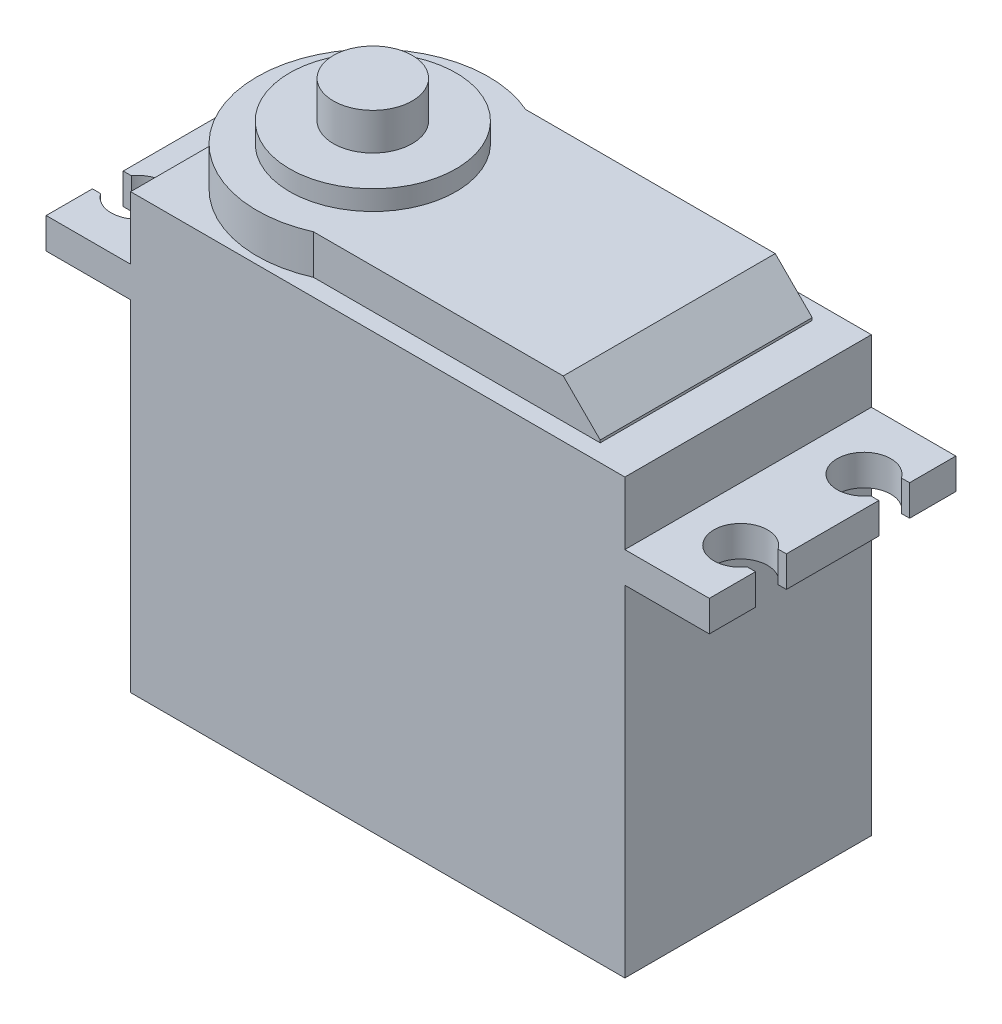
ISO-10303-21;
HEADER;
FILE_DESCRIPTION(('STEP AP214'),'2;1');
FILE_NAME('part.step','',(''),(''),'','','');
FILE_SCHEMA(('AUTOMOTIVE_DESIGN { 1 0 10303 214 1 1 1 1 }'));
ENDSEC;
DATA;
#1=APPLICATION_CONTEXT('core data for automotive mechanical design processes');
#2=APPLICATION_PROTOCOL_DEFINITION('international standard','automotive_design',2000,#1);
#3=PRODUCT_CONTEXT('',#1,'mechanical');
#4=PRODUCT('Part','Part','',(#3));
#5=PRODUCT_RELATED_PRODUCT_CATEGORY('part','',(#4));
#6=PRODUCT_DEFINITION_FORMATION('','',#4);
#7=PRODUCT_DEFINITION_CONTEXT('part definition',#1,'design');
#8=PRODUCT_DEFINITION('design','',#6,#7);
#9=PRODUCT_DEFINITION_SHAPE('','',#8);
#10=(LENGTH_UNIT() NAMED_UNIT(*) SI_UNIT(.MILLI.,.METRE.));
#11=(NAMED_UNIT(*) PLANE_ANGLE_UNIT() SI_UNIT($,.RADIAN.));
#12=(NAMED_UNIT(*) SI_UNIT($,.STERADIAN.) SOLID_ANGLE_UNIT());
#13=UNCERTAINTY_MEASURE_WITH_UNIT(LENGTH_MEASURE(1.E-05),#10,'distance_accuracy_value','');
#14=(GEOMETRIC_REPRESENTATION_CONTEXT(3) GLOBAL_UNCERTAINTY_ASSIGNED_CONTEXT((#13)) GLOBAL_UNIT_ASSIGNED_CONTEXT((#10,
#11,#12)) REPRESENTATION_CONTEXT('',''));
#15=CARTESIAN_POINT('',(0.,0.,0.));
#16=DIRECTION('',(0.,0.,1.));
#17=DIRECTION('',(1.,0.,0.));
#18=AXIS2_PLACEMENT_3D('',#15,#16,#17);
#19=CARTESIAN_POINT('',(0.,0.,20.));
#20=DIRECTION('',(0.,0.,1.));
#21=DIRECTION('',(1.,0.,0.));
#22=AXIS2_PLACEMENT_3D('',#19,#20,#21);
#23=PLANE('',#22);
#24=DIRECTION('',(-1.,0.,0.));
#25=VECTOR('',#24,1.);
#26=CARTESIAN_POINT('',(36.7,35.2,20.));
#27=LINE('',#26,#25);
#28=CARTESIAN_POINT('',(40.1,35.2,20.));
#29=VERTEX_POINT('',#28);
#30=CARTESIAN_POINT('',(0.,35.2,20.));
#31=VERTEX_POINT('',#30);
#32=EDGE_CURVE('E416',#29,#31,#27,.T.);
#33=ORIENTED_EDGE('',*,*,#32,.T.);
#34=DIRECTION('',(0.,-1.,0.));
#35=VECTOR('',#34,1.);
#36=CARTESIAN_POINT('',(0.,38.4,20.));
#37=LINE('',#36,#35);
#38=CARTESIAN_POINT('',(0.,30.1,20.));
#39=VERTEX_POINT('',#38);
#40=EDGE_CURVE('E393',#31,#39,#37,.T.);
#41=ORIENTED_EDGE('',*,*,#40,.T.);
#42=DIRECTION('',(-1.,0.,0.));
#43=VECTOR('',#42,1.);
#44=CARTESIAN_POINT('',(-6.85,30.1,20.));
#45=LINE('',#44,#43);
#46=CARTESIAN_POINT('',(-6.85,30.1,20.));
#47=VERTEX_POINT('',#46);
#48=EDGE_CURVE('E395',#39,#47,#45,.T.);
#49=ORIENTED_EDGE('',*,*,#48,.T.);
#50=DIRECTION('',(0.,-1.,0.));
#51=VECTOR('',#50,1.);
#52=CARTESIAN_POINT('',(-6.85,27.6,20.));
#53=LINE('',#52,#51);
#54=CARTESIAN_POINT('',(-6.85,27.6,20.));
#55=VERTEX_POINT('',#54);
#56=EDGE_CURVE('E398',#47,#55,#53,.T.);
#57=ORIENTED_EDGE('',*,*,#56,.T.);
#58=DIRECTION('',(1.,0.,0.));
#59=VECTOR('',#58,1.);
#60=CARTESIAN_POINT('',(0.,27.6,20.));
#61=LINE('',#60,#59);
#62=CARTESIAN_POINT('',(0.,27.6,20.));
#63=VERTEX_POINT('',#62);
#64=EDGE_CURVE('E400',#55,#63,#61,.T.);
#65=ORIENTED_EDGE('',*,*,#64,.T.);
#66=DIRECTION('',(0.,-1.,0.));
#67=VECTOR('',#66,1.);
#68=CARTESIAN_POINT('',(0.,27.6,20.));
#69=LINE('',#68,#67);
#70=CARTESIAN_POINT('',(0.,0.,20.));
#71=VERTEX_POINT('',#70);
#72=EDGE_CURVE('E402',#63,#71,#69,.T.);
#73=ORIENTED_EDGE('',*,*,#72,.T.);
#74=DIRECTION('',(1.,0.,0.));
#75=VECTOR('',#74,1.);
#76=CARTESIAN_POINT('',(0.,0.,20.));
#77=LINE('',#76,#75);
#78=CARTESIAN_POINT('',(40.1,0.,20.));
#79=VERTEX_POINT('',#78);
#80=EDGE_CURVE('E404',#71,#79,#77,.T.);
#81=ORIENTED_EDGE('',*,*,#80,.T.);
#82=DIRECTION('',(0.,1.,0.));
#83=VECTOR('',#82,1.);
#84=CARTESIAN_POINT('',(40.1,27.6,20.));
#85=LINE('',#84,#83);
#86=CARTESIAN_POINT('',(40.1,27.6,20.));
#87=VERTEX_POINT('',#86);
#88=EDGE_CURVE('E406',#79,#87,#85,.T.);
#89=ORIENTED_EDGE('',*,*,#88,.T.);
#90=DIRECTION('',(1.,0.,0.));
#91=VECTOR('',#90,1.);
#92=CARTESIAN_POINT('',(40.1,27.6,20.));
#93=LINE('',#92,#91);
#94=CARTESIAN_POINT('',(46.95,27.6,20.));
#95=VERTEX_POINT('',#94);
#96=EDGE_CURVE('E408',#87,#95,#93,.T.);
#97=ORIENTED_EDGE('',*,*,#96,.T.);
#98=DIRECTION('',(0.,1.,0.));
#99=VECTOR('',#98,1.);
#100=CARTESIAN_POINT('',(46.95,27.6,20.));
#101=LINE('',#100,#99);
#102=CARTESIAN_POINT('',(46.95,30.1,20.));
#103=VERTEX_POINT('',#102);
#104=EDGE_CURVE('E410',#95,#103,#101,.T.);
#105=ORIENTED_EDGE('',*,*,#104,.T.);
#106=DIRECTION('',(-1.,0.,0.));
#107=VECTOR('',#106,1.);
#108=CARTESIAN_POINT('',(46.95,30.1,20.));
#109=LINE('',#108,#107);
#110=CARTESIAN_POINT('',(40.1,30.1,20.));
#111=VERTEX_POINT('',#110);
#112=EDGE_CURVE('E412',#103,#111,#109,.T.);
#113=ORIENTED_EDGE('',*,*,#112,.T.);
#114=DIRECTION('',(0.,1.,0.));
#115=VECTOR('',#114,1.);
#116=CARTESIAN_POINT('',(40.1,35.2,20.));
#117=LINE('',#116,#115);
#118=EDGE_CURVE('E414',#111,#29,#117,.T.);
#119=ORIENTED_EDGE('',*,*,#118,.T.);
#120=EDGE_LOOP('',(#33,#41,#49,#57,#65,#73,#81,#89,#97,#105,#113,#119));
#121=FACE_BOUND('',#120,.T.);
#122=ADVANCED_FACE('F40',(#121),#23,.T.);
#123=CARTESIAN_POINT('',(0.,0.,0.));
#124=DIRECTION('',(0.,0.,1.));
#125=DIRECTION('',(1.,0.,0.));
#126=AXIS2_PLACEMENT_3D('',#123,#124,#125);
#127=PLANE('',#126);
#128=DIRECTION('',(0.,-1.,0.));
#129=VECTOR('',#128,1.);
#130=CARTESIAN_POINT('',(0.,38.4,0.));
#131=LINE('',#130,#129);
#132=CARTESIAN_POINT('',(0.,35.2,0.));
#133=VERTEX_POINT('',#132);
#134=CARTESIAN_POINT('',(0.,30.1,0.));
#135=VERTEX_POINT('',#134);
#136=EDGE_CURVE('E385',#133,#135,#131,.T.);
#137=ORIENTED_EDGE('',*,*,#136,.F.);
#138=DIRECTION('',(-1.,0.,0.));
#139=VECTOR('',#138,1.);
#140=CARTESIAN_POINT('',(36.7,35.2,0.));
#141=LINE('',#140,#139);
#142=CARTESIAN_POINT('',(40.1,35.2,0.));
#143=VERTEX_POINT('',#142);
#144=EDGE_CURVE('E396',#143,#133,#141,.T.);
#145=ORIENTED_EDGE('',*,*,#144,.F.);
#146=DIRECTION('',(0.,1.,0.));
#147=VECTOR('',#146,1.);
#148=CARTESIAN_POINT('',(40.1,35.2,0.));
#149=LINE('',#148,#147);
#150=CARTESIAN_POINT('',(40.1,30.1,0.));
#151=VERTEX_POINT('',#150);
#152=EDGE_CURVE('E442',#151,#143,#149,.T.);
#153=ORIENTED_EDGE('',*,*,#152,.F.);
#154=DIRECTION('',(-1.,0.,0.));
#155=VECTOR('',#154,1.);
#156=CARTESIAN_POINT('',(46.95,30.1,0.));
#157=LINE('',#156,#155);
#158=CARTESIAN_POINT('',(46.95,30.1,0.));
#159=VERTEX_POINT('',#158);
#160=EDGE_CURVE('E440',#159,#151,#157,.T.);
#161=ORIENTED_EDGE('',*,*,#160,.F.);
#162=DIRECTION('',(0.,1.,0.));
#163=VECTOR('',#162,1.);
#164=CARTESIAN_POINT('',(46.95,27.6,0.));
#165=LINE('',#164,#163);
#166=CARTESIAN_POINT('',(46.95,27.6,0.));
#167=VERTEX_POINT('',#166);
#168=EDGE_CURVE('E437',#167,#159,#165,.T.);
#169=ORIENTED_EDGE('',*,*,#168,.F.);
#170=DIRECTION('',(1.,0.,0.));
#171=VECTOR('',#170,1.);
#172=CARTESIAN_POINT('',(40.1,27.6,0.));
#173=LINE('',#172,#171);
#174=CARTESIAN_POINT('',(40.1,27.6,0.));
#175=VERTEX_POINT('',#174);
#176=EDGE_CURVE('E434',#175,#167,#173,.T.);
#177=ORIENTED_EDGE('',*,*,#176,.F.);
#178=DIRECTION('',(0.,1.,0.));
#179=VECTOR('',#178,1.);
#180=CARTESIAN_POINT('',(40.1,27.6,0.));
#181=LINE('',#180,#179);
#182=CARTESIAN_POINT('',(40.1,0.,0.));
#183=VERTEX_POINT('',#182);
#184=EDGE_CURVE('E432',#183,#175,#181,.T.);
#185=ORIENTED_EDGE('',*,*,#184,.F.);
#186=DIRECTION('',(1.,0.,0.));
#187=VECTOR('',#186,1.);
#188=CARTESIAN_POINT('',(0.,0.,0.));
#189=LINE('',#188,#187);
#190=CARTESIAN_POINT('',(0.,0.,0.));
#191=VERTEX_POINT('',#190);
#192=EDGE_CURVE('E430',#191,#183,#189,.T.);
#193=ORIENTED_EDGE('',*,*,#192,.F.);
#194=DIRECTION('',(0.,-1.,0.));
#195=VECTOR('',#194,1.);
#196=CARTESIAN_POINT('',(0.,27.6,0.));
#197=LINE('',#196,#195);
#198=CARTESIAN_POINT('',(0.,27.6,0.));
#199=VERTEX_POINT('',#198);
#200=EDGE_CURVE('E428',#199,#191,#197,.T.);
#201=ORIENTED_EDGE('',*,*,#200,.F.);
#202=DIRECTION('',(1.,0.,0.));
#203=VECTOR('',#202,1.);
#204=CARTESIAN_POINT('',(0.,27.6,0.));
#205=LINE('',#204,#203);
#206=CARTESIAN_POINT('',(-6.85,27.6,0.));
#207=VERTEX_POINT('',#206);
#208=EDGE_CURVE('E426',#207,#199,#205,.T.);
#209=ORIENTED_EDGE('',*,*,#208,.F.);
#210=DIRECTION('',(0.,-1.,0.));
#211=VECTOR('',#210,1.);
#212=CARTESIAN_POINT('',(-6.85,27.6,0.));
#213=LINE('',#212,#211);
#214=CARTESIAN_POINT('',(-6.85,30.1,0.));
#215=VERTEX_POINT('',#214);
#216=EDGE_CURVE('E423',#215,#207,#213,.T.);
#217=ORIENTED_EDGE('',*,*,#216,.F.);
#218=DIRECTION('',(-1.,0.,0.));
#219=VECTOR('',#218,1.);
#220=CARTESIAN_POINT('',(-6.85,30.1,0.));
#221=LINE('',#220,#219);
#222=EDGE_CURVE('E420',#135,#215,#221,.T.);
#223=ORIENTED_EDGE('',*,*,#222,.F.);
#224=EDGE_LOOP('',(#137,#145,#153,#161,#169,#177,#185,#193,#201,#209,#217,#223));
#225=FACE_BOUND('',#224,.T.);
#226=ADVANCED_FACE('F526',(#225),#127,.F.);
#227=CARTESIAN_POINT('',(0.,38.4,20.));
#228=DIRECTION('',(1.,0.,0.));
#229=DIRECTION('',(0.,1.,0.));
#230=AXIS2_PLACEMENT_3D('',#227,#228,#229);
#231=PLANE('',#230);
#232=DIRECTION('',(0.,0.,1.));
#233=VECTOR('',#232,1.);
#234=CARTESIAN_POINT('',(0.,35.2,20.));
#235=LINE('',#234,#233);
#236=EDGE_CURVE('E287',#133,#31,#235,.T.);
#237=ORIENTED_EDGE('',*,*,#236,.F.);
#238=ORIENTED_EDGE('',*,*,#136,.T.);
#239=DIRECTION('',(0.,0.,-1.));
#240=VECTOR('',#239,1.);
#241=CARTESIAN_POINT('',(0.,30.1,20.));
#242=LINE('',#241,#240);
#243=EDGE_CURVE('E483',#39,#135,#242,.T.);
#244=ORIENTED_EDGE('',*,*,#243,.F.);
#245=ORIENTED_EDGE('',*,*,#40,.F.);
#246=EDGE_LOOP('',(#237,#238,#244,#245));
#247=FACE_BOUND('',#246,.T.);
#248=ADVANCED_FACE('F517',(#247),#231,.F.);
#249=CARTESIAN_POINT('',(36.7,38.4,20.));
#250=DIRECTION('',(-1.,0.,0.));
#251=DIRECTION('',(0.,0.,1.));
#252=AXIS2_PLACEMENT_3D('',#249,#250,#251);
#253=PLANE('',#252);
#254=DIRECTION('',(0.,1.,0.));
#255=VECTOR('',#254,1.);
#256=CARTESIAN_POINT('',(36.7,35.2,1.4));
#257=LINE('',#256,#255);
#258=CARTESIAN_POINT('',(36.7,35.2,1.4));
#259=VERTEX_POINT('',#258);
#260=CARTESIAN_POINT('',(36.7,35.4,1.4));
#261=VERTEX_POINT('',#260);
#262=EDGE_CURVE('E276',#259,#261,#257,.T.);
#263=ORIENTED_EDGE('',*,*,#262,.T.);
#264=DIRECTION('',(0.,0.,1.));
#265=VECTOR('',#264,1.);
#266=CARTESIAN_POINT('',(36.7,35.4,20.));
#267=LINE('',#266,#265);
#268=CARTESIAN_POINT('',(36.7,35.4,18.6));
#269=VERTEX_POINT('',#268);
#270=EDGE_CURVE('E48',#261,#269,#267,.T.);
#271=ORIENTED_EDGE('',*,*,#270,.T.);
#272=DIRECTION('',(0.,1.,0.));
#273=VECTOR('',#272,1.);
#274=CARTESIAN_POINT('',(36.7,35.2,18.6));
#275=LINE('',#274,#273);
#276=CARTESIAN_POINT('',(36.7,35.2,18.6));
#277=VERTEX_POINT('',#276);
#278=EDGE_CURVE('E288',#277,#269,#275,.T.);
#279=ORIENTED_EDGE('',*,*,#278,.F.);
#280=DIRECTION('',(0.,0.,-1.));
#281=VECTOR('',#280,1.);
#282=CARTESIAN_POINT('',(36.7,35.2,20.));
#283=LINE('',#282,#281);
#284=EDGE_CURVE('E418',#277,#259,#283,.T.);
#285=ORIENTED_EDGE('',*,*,#284,.T.);
#286=EDGE_LOOP('',(#263,#271,#279,#285));
#287=FACE_BOUND('',#286,.T.);
#288=ADVANCED_FACE('F515',(#287),#253,.F.);
#289=CARTESIAN_POINT('',(16.402,38.4,20.));
#290=DIRECTION('',(0.,-1.,0.));
#291=DIRECTION('',(0.,0.,-1.));
#292=AXIS2_PLACEMENT_3D('',#289,#290,#291);
#293=PLANE('',#292);
#294=CARTESIAN_POINT('',(9.652,38.4,10.));
#295=DIRECTION('',(0.,1.,0.));
#296=DIRECTION('',(0.,0.,1.));
#297=AXIS2_PLACEMENT_3D('',#294,#295,#296);
#298=CIRCLE('',#297,6.75);
#299=CARTESIAN_POINT('',(9.652,38.4,16.75));
#300=VERTEX_POINT('',#299);
#301=EDGE_CURVE('E294',#300,#300,#298,.T.);
#302=ORIENTED_EDGE('',*,*,#301,.F.);
#303=EDGE_LOOP('',(#302));
#304=FACE_BOUND('',#303,.T.);
#305=DIRECTION('',(1.,0.,0.));
#306=VECTOR('',#305,1.);
#307=CARTESIAN_POINT('',(13.4467331922021,38.4,18.6));
#308=LINE('',#307,#306);
#309=CARTESIAN_POINT('',(13.4467331922021,38.4,18.6));
#310=VERTEX_POINT('',#309);
#311=CARTESIAN_POINT('',(33.7,38.4,18.6));
#312=VERTEX_POINT('',#311);
#313=EDGE_CURVE('E277',#310,#312,#308,.T.);
#314=ORIENTED_EDGE('',*,*,#313,.T.);
#315=DIRECTION('',(0.,0.,-1.));
#316=VECTOR('',#315,1.);
#317=CARTESIAN_POINT('',(33.7,38.4,20.));
#318=LINE('',#317,#316);
#319=CARTESIAN_POINT('',(33.7,38.4,1.4));
#320=VERTEX_POINT('',#319);
#321=EDGE_CURVE('E505',#312,#320,#318,.T.);
#322=ORIENTED_EDGE('',*,*,#321,.T.);
#323=DIRECTION('',(-1.,0.,0.));
#324=VECTOR('',#323,1.);
#325=CARTESIAN_POINT('',(36.7,38.4,1.4));
#326=LINE('',#325,#324);
#327=CARTESIAN_POINT('',(13.4467331922021,38.4,1.4));
#328=VERTEX_POINT('',#327);
#329=EDGE_CURVE('E283',#320,#328,#326,.T.);
#330=ORIENTED_EDGE('',*,*,#329,.T.);
#331=CARTESIAN_POINT('',(9.652,38.4,10.));
#332=DIRECTION('',(0.,1.,0.));
#333=DIRECTION('',(0.,0.,1.));
#334=AXIS2_PLACEMENT_3D('',#331,#332,#333);
#335=CIRCLE('',#334,9.4);
#336=EDGE_CURVE('E261',#328,#310,#335,.T.);
#337=ORIENTED_EDGE('',*,*,#336,.T.);
#338=EDGE_LOOP('',(#314,#322,#330,#337));
#339=FACE_BOUND('',#338,.T.);
#340=ADVANCED_FACE('F510',(#304,#339),#293,.F.);
#341=CARTESIAN_POINT('',(-6.85,27.6,20.));
#342=DIRECTION('',(1.,0.,0.));
#343=DIRECTION('',(0.,0.,-1.));
#344=AXIS2_PLACEMENT_3D('',#341,#342,#343);
#345=PLANE('',#344);
#346=DIRECTION('',(0.,0.,-1.));
#347=VECTOR('',#346,1.);
#348=CARTESIAN_POINT('',(-6.85,30.1,20.));
#349=LINE('',#348,#347);
#350=CARTESIAN_POINT('',(-6.85,30.1,16.25));
#351=VERTEX_POINT('',#350);
#352=EDGE_CURVE('E480',#47,#351,#349,.T.);
#353=ORIENTED_EDGE('',*,*,#352,.T.);
#354=DIRECTION('',(0.,1.,0.));
#355=VECTOR('',#354,1.);
#356=CARTESIAN_POINT('',(-6.84999999999999,0.,16.25));
#357=LINE('',#356,#355);
#358=CARTESIAN_POINT('',(-6.85,27.6,16.25));
#359=VERTEX_POINT('',#358);
#360=EDGE_CURVE('E351',#359,#351,#357,.T.);
#361=ORIENTED_EDGE('',*,*,#360,.F.);
#362=DIRECTION('',(0.,0.,-1.));
#363=VECTOR('',#362,1.);
#364=CARTESIAN_POINT('',(-6.85,27.6,20.));
#365=LINE('',#364,#363);
#366=EDGE_CURVE('E475',#55,#359,#365,.T.);
#367=ORIENTED_EDGE('',*,*,#366,.F.);
#368=ORIENTED_EDGE('',*,*,#56,.F.);
#369=EDGE_LOOP('',(#353,#361,#367,#368));
#370=FACE_BOUND('',#369,.T.);
#371=ADVANCED_FACE('F523',(#370),#345,.F.);
#372=CARTESIAN_POINT('',(46.95,27.6,20.));
#373=DIRECTION('',(-1.,0.,0.));
#374=DIRECTION('',(0.,0.,1.));
#375=AXIS2_PLACEMENT_3D('',#372,#373,#374);
#376=PLANE('',#375);
#377=DIRECTION('',(0.,0.,-1.));
#378=VECTOR('',#377,1.);
#379=CARTESIAN_POINT('',(46.95,27.6,20.));
#380=LINE('',#379,#378);
#381=CARTESIAN_POINT('',(46.95,27.6,13.75));
#382=VERTEX_POINT('',#381);
#383=CARTESIAN_POINT('',(46.95,27.6,6.24999999999999));
#384=VERTEX_POINT('',#383);
#385=EDGE_CURVE('E462',#382,#384,#380,.T.);
#386=ORIENTED_EDGE('',*,*,#385,.T.);
#387=DIRECTION('',(0.,1.,0.));
#388=VECTOR('',#387,1.);
#389=CARTESIAN_POINT('',(46.95,0.,6.24999999999999));
#390=LINE('',#389,#388);
#391=CARTESIAN_POINT('',(46.95,30.1,6.24999999999999));
#392=VERTEX_POINT('',#391);
#393=EDGE_CURVE('E316',#384,#392,#390,.T.);
#394=ORIENTED_EDGE('',*,*,#393,.T.);
#395=DIRECTION('',(0.,0.,-1.));
#396=VECTOR('',#395,1.);
#397=CARTESIAN_POINT('',(46.95,30.1,20.));
#398=LINE('',#397,#396);
#399=CARTESIAN_POINT('',(46.95,30.1,13.75));
#400=VERTEX_POINT('',#399);
#401=EDGE_CURVE('E457',#400,#392,#398,.T.);
#402=ORIENTED_EDGE('',*,*,#401,.F.);
#403=DIRECTION('',(0.,1.,0.));
#404=VECTOR('',#403,1.);
#405=CARTESIAN_POINT('',(46.95,0.,13.75));
#406=LINE('',#405,#404);
#407=EDGE_CURVE('E335',#382,#400,#406,.T.);
#408=ORIENTED_EDGE('',*,*,#407,.F.);
#409=EDGE_LOOP('',(#386,#394,#402,#408));
#410=FACE_BOUND('',#409,.T.);
#411=ADVANCED_FACE('F672',(#410),#376,.F.);
#412=CARTESIAN_POINT('',(46.95,30.1,3.74999999999999));
#413=VERTEX_POINT('',#412);
#414=EDGE_CURVE('E452',#413,#159,#398,.T.);
#415=ORIENTED_EDGE('',*,*,#414,.F.);
#416=DIRECTION('',(0.,1.,0.));
#417=VECTOR('',#416,1.);
#418=CARTESIAN_POINT('',(46.95,0.,3.74999999999999));
#419=LINE('',#418,#417);
#420=CARTESIAN_POINT('',(46.95,27.6,3.74999999999999));
#421=VERTEX_POINT('',#420);
#422=EDGE_CURVE('E315',#421,#413,#419,.T.);
#423=ORIENTED_EDGE('',*,*,#422,.F.);
#424=EDGE_CURVE('E456',#421,#167,#380,.T.);
#425=ORIENTED_EDGE('',*,*,#424,.T.);
#426=ORIENTED_EDGE('',*,*,#168,.T.);
#427=EDGE_LOOP('',(#415,#423,#425,#426));
#428=FACE_BOUND('',#427,.T.);
#429=ADVANCED_FACE('F674',(#428),#376,.F.);
#430=CARTESIAN_POINT('',(-6.85,27.6,3.75));
#431=VERTEX_POINT('',#430);
#432=EDGE_CURVE('E474',#431,#207,#365,.T.);
#433=ORIENTED_EDGE('',*,*,#432,.F.);
#434=DIRECTION('',(0.,1.,0.));
#435=VECTOR('',#434,1.);
#436=CARTESIAN_POINT('',(-6.84999999999999,0.,3.75));
#437=LINE('',#436,#435);
#438=CARTESIAN_POINT('',(-6.85,30.1,3.75));
#439=VERTEX_POINT('',#438);
#440=EDGE_CURVE('E382',#431,#439,#437,.T.);
#441=ORIENTED_EDGE('',*,*,#440,.T.);
#442=EDGE_CURVE('E478',#439,#215,#349,.T.);
#443=ORIENTED_EDGE('',*,*,#442,.T.);
#444=ORIENTED_EDGE('',*,*,#216,.T.);
#445=EDGE_LOOP('',(#433,#441,#443,#444));
#446=FACE_BOUND('',#445,.T.);
#447=ADVANCED_FACE('F636',(#446),#345,.F.);
#448=CARTESIAN_POINT('',(-6.85,30.1,20.));
#449=DIRECTION('',(0.,-1.,0.));
#450=DIRECTION('',(0.,0.,-1.));
#451=AXIS2_PLACEMENT_3D('',#448,#449,#450);
#452=PLANE('',#451);
#453=CARTESIAN_POINT('',(-4.4,30.1,15.));
#454=DIRECTION('',(0.,1.,0.));
#455=DIRECTION('',(1.,0.,0.));
#456=AXIS2_PLACEMENT_3D('',#453,#454,#455);
#457=CIRCLE('',#456,2.18);
#458=CARTESIAN_POINT('',(-6.18602911510423,30.1,16.25));
#459=VERTEX_POINT('',#458);
#460=CARTESIAN_POINT('',(-6.18602911510423,30.1,13.75));
#461=VERTEX_POINT('',#460);
#462=EDGE_CURVE('E303',#459,#461,#457,.T.);
#463=ORIENTED_EDGE('',*,*,#462,.F.);
#464=DIRECTION('',(1.,0.,0.));
#465=VECTOR('',#464,1.);
#466=CARTESIAN_POINT('',(-6.85,30.1,16.25));
#467=LINE('',#466,#465);
#468=EDGE_CURVE('E346',#351,#459,#467,.T.);
#469=ORIENTED_EDGE('',*,*,#468,.F.);
#470=ORIENTED_EDGE('',*,*,#352,.F.);
#471=ORIENTED_EDGE('',*,*,#48,.F.);
#472=ORIENTED_EDGE('',*,*,#243,.T.);
#473=ORIENTED_EDGE('',*,*,#222,.T.);
#474=ORIENTED_EDGE('',*,*,#442,.F.);
#475=DIRECTION('',(-1.,0.,0.));
#476=VECTOR('',#475,1.);
#477=CARTESIAN_POINT('',(-6.85,30.1,3.75));
#478=LINE('',#477,#476);
#479=CARTESIAN_POINT('',(-6.18602911510423,30.1,3.75));
#480=VERTEX_POINT('',#479);
#481=EDGE_CURVE('E374',#480,#439,#478,.T.);
#482=ORIENTED_EDGE('',*,*,#481,.F.);
#483=CARTESIAN_POINT('',(-4.4,30.1,5.));
#484=DIRECTION('',(0.,1.,0.));
#485=DIRECTION('',(-1.,0.,0.));
#486=AXIS2_PLACEMENT_3D('',#483,#484,#485);
#487=CIRCLE('',#486,2.18);
#488=CARTESIAN_POINT('',(-6.18602911510423,30.1,6.25));
#489=VERTEX_POINT('',#488);
#490=EDGE_CURVE('E379',#489,#480,#487,.T.);
#491=ORIENTED_EDGE('',*,*,#490,.F.);
#492=DIRECTION('',(1.,0.,0.));
#493=VECTOR('',#492,1.);
#494=CARTESIAN_POINT('',(-6.85,30.1,6.25));
#495=LINE('',#494,#493);
#496=CARTESIAN_POINT('',(-6.85,30.1,6.25));
#497=VERTEX_POINT('',#496);
#498=EDGE_CURVE('E376',#497,#489,#495,.T.);
#499=ORIENTED_EDGE('',*,*,#498,.F.);
#500=CARTESIAN_POINT('',(-6.85,30.1,13.75));
#501=VERTEX_POINT('',#500);
#502=EDGE_CURVE('E484',#501,#497,#349,.T.);
#503=ORIENTED_EDGE('',*,*,#502,.F.);
#504=DIRECTION('',(-1.,0.,0.));
#505=VECTOR('',#504,1.);
#506=CARTESIAN_POINT('',(-6.85,30.1,13.75));
#507=LINE('',#506,#505);
#508=EDGE_CURVE('E344',#461,#501,#507,.T.);
#509=ORIENTED_EDGE('',*,*,#508,.F.);
#510=EDGE_LOOP('',(#463,#469,#470,#471,#472,#473,#474,#482,#491,#499,#503,#509));
#511=FACE_BOUND('',#510,.T.);
#512=ADVANCED_FACE('F623',(#511),#452,.F.);
#513=CARTESIAN_POINT('',(-6.85,27.6,13.75));
#514=VERTEX_POINT('',#513);
#515=CARTESIAN_POINT('',(-6.85,27.6,6.25));
#516=VERTEX_POINT('',#515);
#517=EDGE_CURVE('E479',#514,#516,#365,.T.);
#518=ORIENTED_EDGE('',*,*,#517,.F.);
#519=DIRECTION('',(0.,1.,0.));
#520=VECTOR('',#519,1.);
#521=CARTESIAN_POINT('',(-6.84999999999999,0.,13.75));
#522=LINE('',#521,#520);
#523=EDGE_CURVE('E353',#514,#501,#522,.T.);
#524=ORIENTED_EDGE('',*,*,#523,.T.);
#525=ORIENTED_EDGE('',*,*,#502,.T.);
#526=DIRECTION('',(0.,1.,0.));
#527=VECTOR('',#526,1.);
#528=CARTESIAN_POINT('',(-6.84999999999999,0.,6.25));
#529=LINE('',#528,#527);
#530=EDGE_CURVE('E388',#516,#497,#529,.T.);
#531=ORIENTED_EDGE('',*,*,#530,.F.);
#532=EDGE_LOOP('',(#518,#524,#525,#531));
#533=FACE_BOUND('',#532,.T.);
#534=ADVANCED_FACE('F662',(#533),#345,.F.);
#535=CARTESIAN_POINT('',(0.,27.6,20.));
#536=DIRECTION('',(0.,1.,0.));
#537=DIRECTION('',(-1.,0.,0.));
#538=AXIS2_PLACEMENT_3D('',#535,#536,#537);
#539=PLANE('',#538);
#540=ORIENTED_EDGE('',*,*,#366,.T.);
#541=DIRECTION('',(1.,0.,0.));
#542=VECTOR('',#541,1.);
#543=CARTESIAN_POINT('',(0.,27.6,16.25));
#544=LINE('',#543,#542);
#545=CARTESIAN_POINT('',(-6.18602911510423,27.6,16.25));
#546=VERTEX_POINT('',#545);
#547=EDGE_CURVE('E502',#359,#546,#544,.T.);
#548=ORIENTED_EDGE('',*,*,#547,.T.);
#549=CARTESIAN_POINT('',(-4.4,27.6,15.));
#550=DIRECTION('',(0.,1.,0.));
#551=DIRECTION('',(-1.,0.,0.));
#552=AXIS2_PLACEMENT_3D('',#549,#550,#551);
#553=CIRCLE('',#552,2.18);
#554=CARTESIAN_POINT('',(-6.18602911510423,27.6,13.75));
#555=VERTEX_POINT('',#554);
#556=EDGE_CURVE('E499',#546,#555,#553,.T.);
#557=ORIENTED_EDGE('',*,*,#556,.T.);
#558=DIRECTION('',(-1.,0.,0.));
#559=VECTOR('',#558,1.);
#560=CARTESIAN_POINT('',(0.,27.6,13.75));
#561=LINE('',#560,#559);
#562=EDGE_CURVE('E496',#555,#514,#561,.T.);
#563=ORIENTED_EDGE('',*,*,#562,.T.);
#564=ORIENTED_EDGE('',*,*,#517,.T.);
#565=DIRECTION('',(1.,0.,0.));
#566=VECTOR('',#565,1.);
#567=CARTESIAN_POINT('',(0.,27.6,6.25000000000001));
#568=LINE('',#567,#566);
#569=CARTESIAN_POINT('',(-6.18602911510422,27.6,6.25));
#570=VERTEX_POINT('',#569);
#571=EDGE_CURVE('E487',#516,#570,#568,.T.);
#572=ORIENTED_EDGE('',*,*,#571,.T.);
#573=CARTESIAN_POINT('',(-4.4,27.6,5.));
#574=DIRECTION('',(0.,1.,0.));
#575=DIRECTION('',(-1.,0.,0.));
#576=AXIS2_PLACEMENT_3D('',#573,#574,#575);
#577=CIRCLE('',#576,2.18);
#578=CARTESIAN_POINT('',(-6.18602911510423,27.6,3.75));
#579=VERTEX_POINT('',#578);
#580=EDGE_CURVE('E490',#570,#579,#577,.T.);
#581=ORIENTED_EDGE('',*,*,#580,.T.);
#582=DIRECTION('',(-1.,0.,0.));
#583=VECTOR('',#582,1.);
#584=CARTESIAN_POINT('',(0.,27.6,3.74999999999999));
#585=LINE('',#584,#583);
#586=EDGE_CURVE('E493',#579,#431,#585,.T.);
#587=ORIENTED_EDGE('',*,*,#586,.T.);
#588=ORIENTED_EDGE('',*,*,#432,.T.);
#589=ORIENTED_EDGE('',*,*,#208,.T.);
#590=DIRECTION('',(0.,0.,-1.));
#591=VECTOR('',#590,1.);
#592=CARTESIAN_POINT('',(0.,27.6,20.));
#593=LINE('',#592,#591);
#594=EDGE_CURVE('E471',#63,#199,#593,.T.);
#595=ORIENTED_EDGE('',*,*,#594,.F.);
#596=ORIENTED_EDGE('',*,*,#64,.F.);
#597=EDGE_LOOP('',(#540,#548,#557,#563,#564,#572,#581,#587,#588,#589,#595,#596));
#598=FACE_BOUND('',#597,.T.);
#599=ADVANCED_FACE('F630',(#598),#539,.F.);
#600=CARTESIAN_POINT('',(0.,27.6,20.));
#601=DIRECTION('',(1.,0.,0.));
#602=DIRECTION('',(0.,1.,0.));
#603=AXIS2_PLACEMENT_3D('',#600,#601,#602);
#604=PLANE('',#603);
#605=ORIENTED_EDGE('',*,*,#200,.T.);
#606=DIRECTION('',(0.,0.,-1.));
#607=VECTOR('',#606,1.);
#608=CARTESIAN_POINT('',(0.,0.,20.));
#609=LINE('',#608,#607);
#610=EDGE_CURVE('E468',#71,#191,#609,.T.);
#611=ORIENTED_EDGE('',*,*,#610,.F.);
#612=ORIENTED_EDGE('',*,*,#72,.F.);
#613=ORIENTED_EDGE('',*,*,#594,.T.);
#614=EDGE_LOOP('',(#605,#611,#612,#613));
#615=FACE_BOUND('',#614,.T.);
#616=ADVANCED_FACE('F644',(#615),#604,.F.);
#617=CARTESIAN_POINT('',(0.,0.,20.));
#618=DIRECTION('',(0.,1.,0.));
#619=DIRECTION('',(-1.,0.,0.));
#620=AXIS2_PLACEMENT_3D('',#617,#618,#619);
#621=PLANE('',#620);
#622=ORIENTED_EDGE('',*,*,#192,.T.);
#623=DIRECTION('',(0.,0.,-1.));
#624=VECTOR('',#623,1.);
#625=CARTESIAN_POINT('',(40.1,0.,20.));
#626=LINE('',#625,#624);
#627=EDGE_CURVE('E465',#79,#183,#626,.T.);
#628=ORIENTED_EDGE('',*,*,#627,.F.);
#629=ORIENTED_EDGE('',*,*,#80,.F.);
#630=ORIENTED_EDGE('',*,*,#610,.T.);
#631=EDGE_LOOP('',(#622,#628,#629,#630));
#632=FACE_BOUND('',#631,.T.);
#633=ADVANCED_FACE('F648',(#632),#621,.F.);
#634=CARTESIAN_POINT('',(40.1,27.6,20.));
#635=DIRECTION('',(-1.,0.,0.));
#636=DIRECTION('',(0.,-1.,0.));
#637=AXIS2_PLACEMENT_3D('',#634,#635,#636);
#638=PLANE('',#637);
#639=ORIENTED_EDGE('',*,*,#184,.T.);
#640=DIRECTION('',(0.,0.,-1.));
#641=VECTOR('',#640,1.);
#642=CARTESIAN_POINT('',(40.1,27.6,20.));
#643=LINE('',#642,#641);
#644=EDGE_CURVE('E461',#87,#175,#643,.T.);
#645=ORIENTED_EDGE('',*,*,#644,.F.);
#646=ORIENTED_EDGE('',*,*,#88,.F.);
#647=ORIENTED_EDGE('',*,*,#627,.T.);
#648=EDGE_LOOP('',(#639,#645,#646,#647));
#649=FACE_BOUND('',#648,.T.);
#650=ADVANCED_FACE('F698',(#649),#638,.F.);
#651=CARTESIAN_POINT('',(40.1,27.6,20.));
#652=DIRECTION('',(0.,1.,0.));
#653=DIRECTION('',(0.,0.,1.));
#654=AXIS2_PLACEMENT_3D('',#651,#652,#653);
#655=PLANE('',#654);
#656=CARTESIAN_POINT('',(44.5,27.6,4.99999999999999));
#657=DIRECTION('',(0.,1.,0.));
#658=DIRECTION('',(0.,0.,1.));
#659=AXIS2_PLACEMENT_3D('',#656,#657,#658);
#660=CIRCLE('',#659,2.18);
#661=CARTESIAN_POINT('',(46.2860291151042,27.6,3.74999999999999));
#662=VERTEX_POINT('',#661);
#663=CARTESIAN_POINT('',(46.2860291151042,27.6,6.24999999999999));
#664=VERTEX_POINT('',#663);
#665=EDGE_CURVE('E368',#662,#664,#660,.T.);
#666=ORIENTED_EDGE('',*,*,#665,.T.);
#667=DIRECTION('',(1.,0.,0.));
#668=VECTOR('',#667,1.);
#669=CARTESIAN_POINT('',(40.1,27.6,6.25));
#670=LINE('',#669,#668);
#671=EDGE_CURVE('E371',#664,#384,#670,.T.);
#672=ORIENTED_EDGE('',*,*,#671,.T.);
#673=ORIENTED_EDGE('',*,*,#385,.F.);
#674=DIRECTION('',(-1.,0.,0.));
#675=VECTOR('',#674,1.);
#676=CARTESIAN_POINT('',(40.1,27.6,13.75));
#677=LINE('',#676,#675);
#678=CARTESIAN_POINT('',(46.2860291151042,27.6,13.75));
#679=VERTEX_POINT('',#678);
#680=EDGE_CURVE('E359',#382,#679,#677,.T.);
#681=ORIENTED_EDGE('',*,*,#680,.T.);
#682=CARTESIAN_POINT('',(44.5,27.6,15.));
#683=DIRECTION('',(0.,1.,0.));
#684=DIRECTION('',(0.,0.,1.));
#685=AXIS2_PLACEMENT_3D('',#682,#683,#684);
#686=CIRCLE('',#685,2.18);
#687=CARTESIAN_POINT('',(46.2860291151042,27.6,16.25));
#688=VERTEX_POINT('',#687);
#689=EDGE_CURVE('E362',#679,#688,#686,.T.);
#690=ORIENTED_EDGE('',*,*,#689,.T.);
#691=DIRECTION('',(1.,0.,0.));
#692=VECTOR('',#691,1.);
#693=CARTESIAN_POINT('',(40.1,27.6,16.25));
#694=LINE('',#693,#692);
#695=CARTESIAN_POINT('',(46.95,27.6,16.25));
#696=VERTEX_POINT('',#695);
#697=EDGE_CURVE('E319',#688,#696,#694,.T.);
#698=ORIENTED_EDGE('',*,*,#697,.T.);
#699=EDGE_CURVE('E458',#95,#696,#380,.T.);
#700=ORIENTED_EDGE('',*,*,#699,.F.);
#701=ORIENTED_EDGE('',*,*,#96,.F.);
#702=ORIENTED_EDGE('',*,*,#644,.T.);
#703=ORIENTED_EDGE('',*,*,#176,.T.);
#704=ORIENTED_EDGE('',*,*,#424,.F.);
#705=DIRECTION('',(-1.,0.,0.));
#706=VECTOR('',#705,1.);
#707=CARTESIAN_POINT('',(40.1,27.6,3.74999999999999));
#708=LINE('',#707,#706);
#709=EDGE_CURVE('E365',#421,#662,#708,.T.);
#710=ORIENTED_EDGE('',*,*,#709,.T.);
#711=EDGE_LOOP('',(#666,#672,#673,#681,#690,#698,#700,#701,#702,#703,#704,#710));
#712=FACE_BOUND('',#711,.T.);
#713=ADVANCED_FACE('F690',(#712),#655,.F.);
#714=ORIENTED_EDGE('',*,*,#699,.T.);
#715=DIRECTION('',(0.,1.,0.));
#716=VECTOR('',#715,1.);
#717=CARTESIAN_POINT('',(46.95,0.,16.25));
#718=LINE('',#717,#716);
#719=CARTESIAN_POINT('',(46.95,30.1,16.25));
#720=VERTEX_POINT('',#719);
#721=EDGE_CURVE('E337',#696,#720,#718,.T.);
#722=ORIENTED_EDGE('',*,*,#721,.T.);
#723=EDGE_CURVE('E453',#103,#720,#398,.T.);
#724=ORIENTED_EDGE('',*,*,#723,.F.);
#725=ORIENTED_EDGE('',*,*,#104,.F.);
#726=EDGE_LOOP('',(#714,#722,#724,#725));
#727=FACE_BOUND('',#726,.T.);
#728=ADVANCED_FACE('F680',(#727),#376,.F.);
#729=CARTESIAN_POINT('',(46.95,30.1,20.));
#730=DIRECTION('',(0.,-1.,0.));
#731=DIRECTION('',(1.,0.,0.));
#732=AXIS2_PLACEMENT_3D('',#729,#730,#731);
#733=PLANE('',#732);
#734=ORIENTED_EDGE('',*,*,#401,.T.);
#735=DIRECTION('',(1.,0.,0.));
#736=VECTOR('',#735,1.);
#737=CARTESIAN_POINT('',(46.95,30.1,6.24999999999999));
#738=LINE('',#737,#736);
#739=CARTESIAN_POINT('',(46.2860291151042,30.1,6.24999999999999));
#740=VERTEX_POINT('',#739);
#741=EDGE_CURVE('E313',#740,#392,#738,.T.);
#742=ORIENTED_EDGE('',*,*,#741,.F.);
#743=CARTESIAN_POINT('',(44.5,30.1,4.99999999999999));
#744=DIRECTION('',(0.,1.,0.));
#745=DIRECTION('',(1.,0.,0.));
#746=AXIS2_PLACEMENT_3D('',#743,#744,#745);
#747=CIRCLE('',#746,2.18);
#748=CARTESIAN_POINT('',(46.2860291151042,30.1,3.74999999999999));
#749=VERTEX_POINT('',#748);
#750=EDGE_CURVE('E309',#749,#740,#747,.T.);
#751=ORIENTED_EDGE('',*,*,#750,.F.);
#752=DIRECTION('',(-1.,0.,0.));
#753=VECTOR('',#752,1.);
#754=CARTESIAN_POINT('',(46.95,30.1,3.74999999999999));
#755=LINE('',#754,#753);
#756=EDGE_CURVE('E306',#413,#749,#755,.T.);
#757=ORIENTED_EDGE('',*,*,#756,.F.);
#758=ORIENTED_EDGE('',*,*,#414,.T.);
#759=ORIENTED_EDGE('',*,*,#160,.T.);
#760=DIRECTION('',(0.,0.,-1.));
#761=VECTOR('',#760,1.);
#762=CARTESIAN_POINT('',(40.1,30.1,20.));
#763=LINE('',#762,#761);
#764=EDGE_CURVE('E449',#111,#151,#763,.T.);
#765=ORIENTED_EDGE('',*,*,#764,.F.);
#766=ORIENTED_EDGE('',*,*,#112,.F.);
#767=ORIENTED_EDGE('',*,*,#723,.T.);
#768=DIRECTION('',(1.,0.,0.));
#769=VECTOR('',#768,1.);
#770=CARTESIAN_POINT('',(46.95,30.1,16.25));
#771=LINE('',#770,#769);
#772=CARTESIAN_POINT('',(46.2860291151042,30.1,16.25));
#773=VERTEX_POINT('',#772);
#774=EDGE_CURVE('E327',#773,#720,#771,.T.);
#775=ORIENTED_EDGE('',*,*,#774,.F.);
#776=CARTESIAN_POINT('',(44.5,30.1,15.));
#777=DIRECTION('',(0.,1.,0.));
#778=DIRECTION('',(-1.,0.,0.));
#779=AXIS2_PLACEMENT_3D('',#776,#777,#778);
#780=CIRCLE('',#779,2.18);
#781=CARTESIAN_POINT('',(46.2860291151042,30.1,13.75));
#782=VERTEX_POINT('',#781);
#783=EDGE_CURVE('E325',#782,#773,#780,.T.);
#784=ORIENTED_EDGE('',*,*,#783,.F.);
#785=DIRECTION('',(-1.,0.,0.));
#786=VECTOR('',#785,1.);
#787=CARTESIAN_POINT('',(46.95,30.1,13.75));
#788=LINE('',#787,#786);
#789=EDGE_CURVE('E330',#400,#782,#788,.T.);
#790=ORIENTED_EDGE('',*,*,#789,.F.);
#791=EDGE_LOOP('',(#734,#742,#751,#757,#758,#759,#765,#766,#767,#775,#784,#790));
#792=FACE_BOUND('',#791,.T.);
#793=ADVANCED_FACE('F689',(#792),#733,.F.);
#794=CARTESIAN_POINT('',(40.1,35.2,20.));
#795=DIRECTION('',(-1.,0.,0.));
#796=DIRECTION('',(0.,0.,1.));
#797=AXIS2_PLACEMENT_3D('',#794,#795,#796);
#798=PLANE('',#797);
#799=ORIENTED_EDGE('',*,*,#152,.T.);
#800=DIRECTION('',(0.,0.,-1.));
#801=VECTOR('',#800,1.);
#802=CARTESIAN_POINT('',(40.1,35.2,20.));
#803=LINE('',#802,#801);
#804=EDGE_CURVE('E446',#29,#143,#803,.T.);
#805=ORIENTED_EDGE('',*,*,#804,.F.);
#806=ORIENTED_EDGE('',*,*,#118,.F.);
#807=ORIENTED_EDGE('',*,*,#764,.T.);
#808=EDGE_LOOP('',(#799,#805,#806,#807));
#809=FACE_BOUND('',#808,.T.);
#810=ADVANCED_FACE('F696',(#809),#798,.F.);
#811=CARTESIAN_POINT('',(36.7,35.2,20.));
#812=DIRECTION('',(0.,-1.,0.));
#813=DIRECTION('',(0.,0.,-1.));
#814=AXIS2_PLACEMENT_3D('',#811,#812,#813);
#815=PLANE('',#814);
#816=ORIENTED_EDGE('',*,*,#284,.F.);
#817=DIRECTION('',(1.,0.,0.));
#818=VECTOR('',#817,1.);
#819=CARTESIAN_POINT('',(13.4467331922021,35.2,18.6));
#820=LINE('',#819,#818);
#821=CARTESIAN_POINT('',(13.4467331922021,35.2,18.6));
#822=VERTEX_POINT('',#821);
#823=EDGE_CURVE('E264',#822,#277,#820,.T.);
#824=ORIENTED_EDGE('',*,*,#823,.F.);
#825=CARTESIAN_POINT('',(9.652,35.2,10.));
#826=DIRECTION('',(0.,1.,0.));
#827=DIRECTION('',(0.,0.,1.));
#828=AXIS2_PLACEMENT_3D('',#825,#826,#827);
#829=CIRCLE('',#828,9.4);
#830=CARTESIAN_POINT('',(13.4467331922021,35.2,1.4));
#831=VERTEX_POINT('',#830);
#832=EDGE_CURVE('E259',#831,#822,#829,.T.);
#833=ORIENTED_EDGE('',*,*,#832,.F.);
#834=DIRECTION('',(-1.,0.,0.));
#835=VECTOR('',#834,1.);
#836=CARTESIAN_POINT('',(36.7,35.2,1.4));
#837=LINE('',#836,#835);
#838=EDGE_CURVE('E271',#259,#831,#837,.T.);
#839=ORIENTED_EDGE('',*,*,#838,.F.);
#840=EDGE_LOOP('',(#816,#824,#833,#839));
#841=FACE_BOUND('',#840,.T.);
#842=ORIENTED_EDGE('',*,*,#144,.T.);
#843=ORIENTED_EDGE('',*,*,#236,.T.);
#844=ORIENTED_EDGE('',*,*,#32,.F.);
#845=ORIENTED_EDGE('',*,*,#804,.T.);
#846=EDGE_LOOP('',(#842,#843,#844,#845));
#847=FACE_BOUND('',#846,.T.);
#848=ADVANCED_FACE('F269',(#841,#847),#815,.F.);
#849=CARTESIAN_POINT('',(-6.84999999999999,0.,3.75));
#850=DIRECTION('',(0.,0.,-1.));
#851=DIRECTION('',(-1.,0.,0.));
#852=AXIS2_PLACEMENT_3D('',#849,#850,#851);
#853=PLANE('',#852);
#854=DIRECTION('',(0.,1.,0.));
#855=VECTOR('',#854,1.);
#856=CARTESIAN_POINT('',(-6.18602911510422,0.,3.75));
#857=LINE('',#856,#855);
#858=EDGE_CURVE('E383',#579,#480,#857,.T.);
#859=ORIENTED_EDGE('',*,*,#858,.T.);
#860=ORIENTED_EDGE('',*,*,#481,.T.);
#861=ORIENTED_EDGE('',*,*,#440,.F.);
#862=ORIENTED_EDGE('',*,*,#586,.F.);
#863=EDGE_LOOP('',(#859,#860,#861,#862));
#864=FACE_BOUND('',#863,.T.);
#865=ADVANCED_FACE('F538',(#864),#853,.F.);
#866=CARTESIAN_POINT('',(-4.39999999999999,0.,5.));
#867=DIRECTION('',(0.,1.,0.));
#868=DIRECTION('',(-1.,0.,0.));
#869=AXIS2_PLACEMENT_3D('',#866,#867,#868);
#870=CYLINDRICAL_SURFACE('',#869,2.18);
#871=DIRECTION('',(0.,1.,0.));
#872=VECTOR('',#871,1.);
#873=CARTESIAN_POINT('',(-6.18602911510422,0.,6.25));
#874=LINE('',#873,#872);
#875=EDGE_CURVE('E386',#570,#489,#874,.T.);
#876=ORIENTED_EDGE('',*,*,#875,.T.);
#877=ORIENTED_EDGE('',*,*,#490,.T.);
#878=ORIENTED_EDGE('',*,*,#858,.F.);
#879=ORIENTED_EDGE('',*,*,#580,.F.);
#880=EDGE_LOOP('',(#876,#877,#878,#879));
#881=FACE_BOUND('',#880,.T.);
#882=ADVANCED_FACE('F607',(#881),#870,.F.);
#883=CARTESIAN_POINT('',(-6.84999999999999,0.,6.25));
#884=DIRECTION('',(0.,0.,1.));
#885=DIRECTION('',(1.,0.,0.));
#886=AXIS2_PLACEMENT_3D('',#883,#884,#885);
#887=PLANE('',#886);
#888=ORIENTED_EDGE('',*,*,#530,.T.);
#889=ORIENTED_EDGE('',*,*,#498,.T.);
#890=ORIENTED_EDGE('',*,*,#875,.F.);
#891=ORIENTED_EDGE('',*,*,#571,.F.);
#892=EDGE_LOOP('',(#888,#889,#890,#891));
#893=FACE_BOUND('',#892,.T.);
#894=ADVANCED_FACE('F599',(#893),#887,.F.);
#895=CARTESIAN_POINT('',(44.5,0.,15.));
#896=DIRECTION('',(0.,1.,0.));
#897=DIRECTION('',(-1.,0.,0.));
#898=AXIS2_PLACEMENT_3D('',#895,#896,#897);
#899=CYLINDRICAL_SURFACE('',#898,2.18);
#900=DIRECTION('',(0.,1.,0.));
#901=VECTOR('',#900,1.);
#902=CARTESIAN_POINT('',(46.2860291151042,0.,13.75));
#903=LINE('',#902,#901);
#904=EDGE_CURVE('E310',#679,#782,#903,.T.);
#905=ORIENTED_EDGE('',*,*,#904,.T.);
#906=ORIENTED_EDGE('',*,*,#783,.T.);
#907=DIRECTION('',(0.,1.,0.));
#908=VECTOR('',#907,1.);
#909=CARTESIAN_POINT('',(46.2860291151042,0.,16.25));
#910=LINE('',#909,#908);
#911=EDGE_CURVE('E333',#688,#773,#910,.T.);
#912=ORIENTED_EDGE('',*,*,#911,.F.);
#913=ORIENTED_EDGE('',*,*,#689,.F.);
#914=EDGE_LOOP('',(#905,#906,#912,#913));
#915=FACE_BOUND('',#914,.T.);
#916=ADVANCED_FACE('F592',(#915),#899,.F.);
#917=CARTESIAN_POINT('',(46.95,0.,13.75));
#918=DIRECTION('',(0.,0.,-1.));
#919=DIRECTION('',(-1.,0.,0.));
#920=AXIS2_PLACEMENT_3D('',#917,#918,#919);
#921=PLANE('',#920);
#922=ORIENTED_EDGE('',*,*,#407,.T.);
#923=ORIENTED_EDGE('',*,*,#789,.T.);
#924=ORIENTED_EDGE('',*,*,#904,.F.);
#925=ORIENTED_EDGE('',*,*,#680,.F.);
#926=EDGE_LOOP('',(#922,#923,#924,#925));
#927=FACE_BOUND('',#926,.T.);
#928=ADVANCED_FACE('F589',(#927),#921,.F.);
#929=CARTESIAN_POINT('',(46.95,0.,16.25));
#930=DIRECTION('',(0.,0.,1.));
#931=DIRECTION('',(1.,0.,0.));
#932=AXIS2_PLACEMENT_3D('',#929,#930,#931);
#933=PLANE('',#932);
#934=ORIENTED_EDGE('',*,*,#911,.T.);
#935=ORIENTED_EDGE('',*,*,#774,.T.);
#936=ORIENTED_EDGE('',*,*,#721,.F.);
#937=ORIENTED_EDGE('',*,*,#697,.F.);
#938=EDGE_LOOP('',(#934,#935,#936,#937));
#939=FACE_BOUND('',#938,.T.);
#940=ADVANCED_FACE('F579',(#939),#933,.F.);
#941=CARTESIAN_POINT('',(46.95,0.,6.24999999999999));
#942=DIRECTION('',(0.,0.,1.));
#943=DIRECTION('',(1.,0.,0.));
#944=AXIS2_PLACEMENT_3D('',#941,#942,#943);
#945=PLANE('',#944);
#946=DIRECTION('',(0.,1.,0.));
#947=VECTOR('',#946,1.);
#948=CARTESIAN_POINT('',(46.2860291151042,0.,6.24999999999999));
#949=LINE('',#948,#947);
#950=EDGE_CURVE('E320',#664,#740,#949,.T.);
#951=ORIENTED_EDGE('',*,*,#950,.T.);
#952=ORIENTED_EDGE('',*,*,#741,.T.);
#953=ORIENTED_EDGE('',*,*,#393,.F.);
#954=ORIENTED_EDGE('',*,*,#671,.F.);
#955=EDGE_LOOP('',(#951,#952,#953,#954));
#956=FACE_BOUND('',#955,.T.);
#957=ADVANCED_FACE('F575',(#956),#945,.F.);
#958=CARTESIAN_POINT('',(44.5,0.,4.99999999999999));
#959=DIRECTION('',(0.,1.,0.));
#960=DIRECTION('',(-1.,0.,0.));
#961=AXIS2_PLACEMENT_3D('',#958,#959,#960);
#962=CYLINDRICAL_SURFACE('',#961,2.18);
#963=DIRECTION('',(0.,1.,0.));
#964=VECTOR('',#963,1.);
#965=CARTESIAN_POINT('',(46.2860291151042,0.,3.74999999999999));
#966=LINE('',#965,#964);
#967=EDGE_CURVE('E322',#662,#749,#966,.T.);
#968=ORIENTED_EDGE('',*,*,#967,.T.);
#969=ORIENTED_EDGE('',*,*,#750,.T.);
#970=ORIENTED_EDGE('',*,*,#950,.F.);
#971=ORIENTED_EDGE('',*,*,#665,.F.);
#972=EDGE_LOOP('',(#968,#969,#970,#971));
#973=FACE_BOUND('',#972,.T.);
#974=ADVANCED_FACE('F578',(#973),#962,.F.);
#975=CARTESIAN_POINT('',(46.95,0.,3.74999999999999));
#976=DIRECTION('',(0.,0.,-1.));
#977=DIRECTION('',(-1.,0.,0.));
#978=AXIS2_PLACEMENT_3D('',#975,#976,#977);
#979=PLANE('',#978);
#980=ORIENTED_EDGE('',*,*,#422,.T.);
#981=ORIENTED_EDGE('',*,*,#756,.T.);
#982=ORIENTED_EDGE('',*,*,#967,.F.);
#983=ORIENTED_EDGE('',*,*,#709,.F.);
#984=EDGE_LOOP('',(#980,#981,#982,#983));
#985=FACE_BOUND('',#984,.T.);
#986=ADVANCED_FACE('F583',(#985),#979,.F.);
#987=CARTESIAN_POINT('',(-4.39999999999999,0.,15.));
#988=DIRECTION('',(0.,1.,0.));
#989=DIRECTION('',(-1.,0.,0.));
#990=AXIS2_PLACEMENT_3D('',#987,#988,#989);
#991=CYLINDRICAL_SURFACE('',#990,2.18);
#992=DIRECTION('',(0.,1.,0.));
#993=VECTOR('',#992,1.);
#994=CARTESIAN_POINT('',(-6.18602911510422,0.,16.25));
#995=LINE('',#994,#993);
#996=EDGE_CURVE('E328',#546,#459,#995,.T.);
#997=ORIENTED_EDGE('',*,*,#996,.T.);
#998=ORIENTED_EDGE('',*,*,#462,.T.);
#999=DIRECTION('',(0.,1.,0.));
#1000=VECTOR('',#999,1.);
#1001=CARTESIAN_POINT('',(-6.18602911510422,0.,13.75));
#1002=LINE('',#1001,#1000);
#1003=EDGE_CURVE('E349',#555,#461,#1002,.T.);
#1004=ORIENTED_EDGE('',*,*,#1003,.F.);
#1005=ORIENTED_EDGE('',*,*,#556,.F.);
#1006=EDGE_LOOP('',(#997,#998,#1004,#1005));
#1007=FACE_BOUND('',#1006,.T.);
#1008=ADVANCED_FACE('F587',(#1007),#991,.F.);
#1009=CARTESIAN_POINT('',(-6.84999999999999,0.,16.25));
#1010=DIRECTION('',(0.,0.,1.));
#1011=DIRECTION('',(1.,0.,0.));
#1012=AXIS2_PLACEMENT_3D('',#1009,#1010,#1011);
#1013=PLANE('',#1012);
#1014=ORIENTED_EDGE('',*,*,#360,.T.);
#1015=ORIENTED_EDGE('',*,*,#468,.T.);
#1016=ORIENTED_EDGE('',*,*,#996,.F.);
#1017=ORIENTED_EDGE('',*,*,#547,.F.);
#1018=EDGE_LOOP('',(#1014,#1015,#1016,#1017));
#1019=FACE_BOUND('',#1018,.T.);
#1020=ADVANCED_FACE('F569',(#1019),#1013,.F.);
#1021=CARTESIAN_POINT('',(-6.84999999999999,0.,13.75));
#1022=DIRECTION('',(0.,0.,-1.));
#1023=DIRECTION('',(-1.,0.,0.));
#1024=AXIS2_PLACEMENT_3D('',#1021,#1022,#1023);
#1025=PLANE('',#1024);
#1026=ORIENTED_EDGE('',*,*,#1003,.T.);
#1027=ORIENTED_EDGE('',*,*,#508,.T.);
#1028=ORIENTED_EDGE('',*,*,#523,.F.);
#1029=ORIENTED_EDGE('',*,*,#562,.F.);
#1030=EDGE_LOOP('',(#1026,#1027,#1028,#1029));
#1031=FACE_BOUND('',#1030,.T.);
#1032=ADVANCED_FACE('F556',(#1031),#1025,.F.);
#1033=CARTESIAN_POINT('',(9.652,38.4,10.));
#1034=DIRECTION('',(0.,1.,0.));
#1035=DIRECTION('',(0.,0.,1.));
#1036=AXIS2_PLACEMENT_3D('',#1033,#1034,#1035);
#1037=CYLINDRICAL_SURFACE('',#1036,6.75);
#1038=CARTESIAN_POINT('',(9.652,40.,10.));
#1039=DIRECTION('',(0.,1.,0.));
#1040=DIRECTION('',(0.,0.,1.));
#1041=AXIS2_PLACEMENT_3D('',#1038,#1039,#1040);
#1042=CIRCLE('',#1041,6.75);
#1043=CARTESIAN_POINT('',(9.652,40.,16.75));
#1044=VERTEX_POINT('',#1043);
#1045=EDGE_CURVE('E293',#1044,#1044,#1042,.T.);
#1046=ORIENTED_EDGE('',*,*,#1045,.F.);
#1047=EDGE_LOOP('',(#1046));
#1048=FACE_BOUND('',#1047,.T.);
#1049=ORIENTED_EDGE('',*,*,#301,.T.);
#1050=EDGE_LOOP('',(#1049));
#1051=FACE_BOUND('',#1050,.T.);
#1052=ADVANCED_FACE('F548',(#1048,#1051),#1037,.T.);
#1053=CARTESIAN_POINT('',(6.452,43.,20.));
#1054=DIRECTION('',(0.,-1.,0.));
#1055=DIRECTION('',(0.,0.,-1.));
#1056=AXIS2_PLACEMENT_3D('',#1053,#1054,#1055);
#1057=PLANE('',#1056);
#1058=CARTESIAN_POINT('',(9.65199999999995,43.,10.));
#1059=DIRECTION('',(0.,1.,0.));
#1060=DIRECTION('',(-1.,0.,0.));
#1061=AXIS2_PLACEMENT_3D('',#1058,#1059,#1060);
#1062=CIRCLE('',#1061,3.2);
#1063=CARTESIAN_POINT('',(6.45199999999995,43.,10.));
#1064=VERTEX_POINT('',#1063);
#1065=EDGE_CURVE('E297',#1064,#1064,#1062,.T.);
#1066=ORIENTED_EDGE('',*,*,#1065,.T.);
#1067=EDGE_LOOP('',(#1066));
#1068=FACE_BOUND('',#1067,.T.);
#1069=ADVANCED_FACE('F546',(#1068),#1057,.F.);
#1070=CARTESIAN_POINT('',(9.65199999999995,40.,10.));
#1071=DIRECTION('',(0.,1.,0.));
#1072=DIRECTION('',(-1.,0.,0.));
#1073=AXIS2_PLACEMENT_3D('',#1070,#1071,#1072);
#1074=CYLINDRICAL_SURFACE('',#1073,3.2);
#1075=ORIENTED_EDGE('',*,*,#1065,.F.);
#1076=EDGE_LOOP('',(#1075));
#1077=FACE_BOUND('',#1076,.T.);
#1078=CARTESIAN_POINT('',(9.65199999999995,40.,10.));
#1079=DIRECTION('',(0.,1.,0.));
#1080=DIRECTION('',(-1.,0.,0.));
#1081=AXIS2_PLACEMENT_3D('',#1078,#1079,#1080);
#1082=CIRCLE('',#1081,3.2);
#1083=CARTESIAN_POINT('',(6.45199999999995,40.,10.));
#1084=VERTEX_POINT('',#1083);
#1085=EDGE_CURVE('E300',#1084,#1084,#1082,.T.);
#1086=ORIENTED_EDGE('',*,*,#1085,.T.);
#1087=EDGE_LOOP('',(#1086));
#1088=FACE_BOUND('',#1087,.T.);
#1089=ADVANCED_FACE('F544',(#1077,#1088),#1074,.T.);
#1090=CARTESIAN_POINT('',(2.90199999999999,40.,20.));
#1091=DIRECTION('',(0.,-1.,0.));
#1092=DIRECTION('',(0.,0.,-1.));
#1093=AXIS2_PLACEMENT_3D('',#1090,#1091,#1092);
#1094=PLANE('',#1093);
#1095=ORIENTED_EDGE('',*,*,#1085,.F.);
#1096=EDGE_LOOP('',(#1095));
#1097=FACE_BOUND('',#1096,.T.);
#1098=ORIENTED_EDGE('',*,*,#1045,.T.);
#1099=EDGE_LOOP('',(#1098));
#1100=FACE_BOUND('',#1099,.T.);
#1101=ADVANCED_FACE('F541',(#1097,#1100),#1094,.F.);
#1102=CARTESIAN_POINT('',(36.7,35.2,1.4));
#1103=DIRECTION('',(0.,0.,-1.));
#1104=DIRECTION('',(-1.,0.,0.));
#1105=AXIS2_PLACEMENT_3D('',#1102,#1103,#1104);
#1106=PLANE('',#1105);
#1107=ORIENTED_EDGE('',*,*,#329,.F.);
#1108=DIRECTION('',(-0.707106781186547,0.707106781186548,0.));
#1109=VECTOR('',#1108,1.);
#1110=CARTESIAN_POINT('',(36.8,35.3,1.4));
#1111=LINE('',#1110,#1109);
#1112=EDGE_CURVE('E62',#320,#261,#1111,.F.);
#1113=ORIENTED_EDGE('',*,*,#1112,.T.);
#1114=ORIENTED_EDGE('',*,*,#262,.F.);
#1115=ORIENTED_EDGE('',*,*,#838,.T.);
#1116=DIRECTION('',(0.,1.,0.));
#1117=VECTOR('',#1116,1.);
#1118=CARTESIAN_POINT('',(13.4467331922021,35.2,1.4));
#1119=LINE('',#1118,#1117);
#1120=EDGE_CURVE('E255',#831,#328,#1119,.T.);
#1121=ORIENTED_EDGE('',*,*,#1120,.T.);
#1122=EDGE_LOOP('',(#1107,#1113,#1114,#1115,#1121));
#1123=FACE_BOUND('',#1122,.T.);
#1124=ADVANCED_FACE('F275',(#1123),#1106,.T.);
#1125=CARTESIAN_POINT('',(13.4467331922021,35.2,18.6));
#1126=DIRECTION('',(0.,0.,1.));
#1127=DIRECTION('',(1.,0.,0.));
#1128=AXIS2_PLACEMENT_3D('',#1125,#1126,#1127);
#1129=PLANE('',#1128);
#1130=ORIENTED_EDGE('',*,*,#278,.T.);
#1131=DIRECTION('',(0.707106781186547,-0.707106781186548,0.));
#1132=VECTOR('',#1131,1.);
#1133=CARTESIAN_POINT('',(25.173366596101,46.926633403899,18.6));
#1134=LINE('',#1133,#1132);
#1135=EDGE_CURVE('E11',#269,#312,#1134,.F.);
#1136=ORIENTED_EDGE('',*,*,#1135,.T.);
#1137=ORIENTED_EDGE('',*,*,#313,.F.);
#1138=DIRECTION('',(0.,1.,0.));
#1139=VECTOR('',#1138,1.);
#1140=CARTESIAN_POINT('',(13.4467331922021,35.2,18.6));
#1141=LINE('',#1140,#1139);
#1142=EDGE_CURVE('E263',#822,#310,#1141,.T.);
#1143=ORIENTED_EDGE('',*,*,#1142,.F.);
#1144=ORIENTED_EDGE('',*,*,#823,.T.);
#1145=EDGE_LOOP('',(#1130,#1136,#1137,#1143,#1144));
#1146=FACE_BOUND('',#1145,.T.);
#1147=ADVANCED_FACE('F514',(#1146),#1129,.T.);
#1148=CARTESIAN_POINT('',(9.652,35.2,10.));
#1149=DIRECTION('',(0.,1.,0.));
#1150=DIRECTION('',(0.,0.,1.));
#1151=AXIS2_PLACEMENT_3D('',#1148,#1149,#1150);
#1152=CYLINDRICAL_SURFACE('',#1151,9.4);
#1153=ORIENTED_EDGE('',*,*,#336,.F.);
#1154=ORIENTED_EDGE('',*,*,#1120,.F.);
#1155=ORIENTED_EDGE('',*,*,#832,.T.);
#1156=ORIENTED_EDGE('',*,*,#1142,.T.);
#1157=EDGE_LOOP('',(#1153,#1154,#1155,#1156));
#1158=FACE_BOUND('',#1157,.T.);
#1159=ADVANCED_FACE('F257',(#1158),#1152,.T.);
#1160=CARTESIAN_POINT('',(33.7,38.4,20.));
#1161=DIRECTION('',(-0.707106781186548,-0.707106781186547,0.));
#1162=DIRECTION('',(0.,0.,-1.));
#1163=AXIS2_PLACEMENT_3D('',#1160,#1161,#1162);
#1164=PLANE('',#1163);
#1165=ORIENTED_EDGE('',*,*,#1135,.F.);
#1166=ORIENTED_EDGE('',*,*,#270,.F.);
#1167=ORIENTED_EDGE('',*,*,#1112,.F.);
#1168=ORIENTED_EDGE('',*,*,#321,.F.);
#1169=EDGE_LOOP('',(#1165,#1166,#1167,#1168));
#1170=FACE_BOUND('',#1169,.T.);
#1171=ADVANCED_FACE('F42',(#1170),#1164,.F.);
#1172=CLOSED_SHELL('',(#122,#226,#248,#288,#340,#371,#411,#429,#447,#512,#534,#599,#616,#633,
#650,#713,#728,#793,#810,#848,#865,#882,#894,#916,#928,#940,#957,#974,#986,#1008,#1020,#1032,
#1052,#1069,#1089,#1101,#1124,#1147,#1159,#1171));
#1173=MANIFOLD_SOLID_BREP('B2',#1172);
#1174=ADVANCED_BREP_SHAPE_REPRESENTATION('',(#18,#1173),#14);
#1175=SHAPE_DEFINITION_REPRESENTATION(#9,#1174);
ENDSEC;
END-ISO-10303-21;
